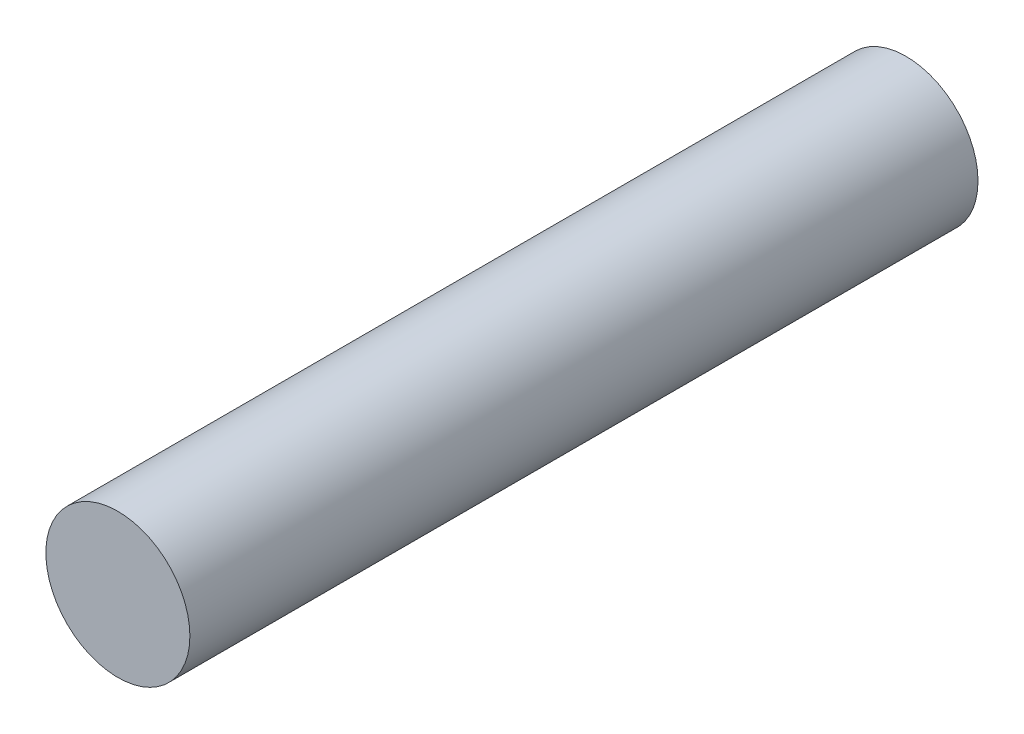
ISO-10303-21;
HEADER;
FILE_DESCRIPTION(('STEP AP214'),'2;1');
FILE_NAME('part.step','',(''),(''),'','','');
FILE_SCHEMA(('AUTOMOTIVE_DESIGN { 1 0 10303 214 1 1 1 1 }'));
ENDSEC;
DATA;
#1=APPLICATION_CONTEXT('core data for automotive mechanical design processes');
#2=APPLICATION_PROTOCOL_DEFINITION('international standard','automotive_design',2000,#1);
#3=PRODUCT_CONTEXT('',#1,'mechanical');
#4=PRODUCT('Part','Part','',(#3));
#5=PRODUCT_RELATED_PRODUCT_CATEGORY('part','',(#4));
#6=PRODUCT_DEFINITION_FORMATION('','',#4);
#7=PRODUCT_DEFINITION_CONTEXT('part definition',#1,'design');
#8=PRODUCT_DEFINITION('design','',#6,#7);
#9=PRODUCT_DEFINITION_SHAPE('','',#8);
#10=(LENGTH_UNIT() NAMED_UNIT(*) SI_UNIT(.MILLI.,.METRE.));
#11=(NAMED_UNIT(*) PLANE_ANGLE_UNIT() SI_UNIT($,.RADIAN.));
#12=(NAMED_UNIT(*) SI_UNIT($,.STERADIAN.) SOLID_ANGLE_UNIT());
#13=UNCERTAINTY_MEASURE_WITH_UNIT(LENGTH_MEASURE(1.E-05),#10,'distance_accuracy_value','');
#14=(GEOMETRIC_REPRESENTATION_CONTEXT(3) GLOBAL_UNCERTAINTY_ASSIGNED_CONTEXT((#13)) GLOBAL_UNIT_ASSIGNED_CONTEXT((#10,
#11,#12)) REPRESENTATION_CONTEXT('',''));
#15=CARTESIAN_POINT('',(0.,0.,0.));
#16=DIRECTION('',(0.,0.,1.));
#17=DIRECTION('',(1.,0.,0.));
#18=AXIS2_PLACEMENT_3D('',#15,#16,#17);
#19=CARTESIAN_POINT('',(0.,0.,580.));
#20=DIRECTION('',(0.,0.,-1.));
#21=DIRECTION('',(-1.,0.,0.));
#22=AXIS2_PLACEMENT_3D('',#19,#20,#21);
#23=CYLINDRICAL_SURFACE('',#22,53.);
#24=CARTESIAN_POINT('',(0.,0.,580.));
#25=DIRECTION('',(0.,0.,1.));
#26=DIRECTION('',(1.,0.,0.));
#27=AXIS2_PLACEMENT_3D('',#24,#25,#26);
#28=CIRCLE('',#27,53.);
#29=CARTESIAN_POINT('',(53.,0.,580.));
#30=VERTEX_POINT('',#29);
#31=EDGE_CURVE('E10',#30,#30,#28,.T.);
#32=ORIENTED_EDGE('',*,*,#31,.F.);
#33=EDGE_LOOP('',(#32));
#34=FACE_BOUND('',#33,.T.);
#35=CARTESIAN_POINT('',(0.,0.,0.));
#36=DIRECTION('',(0.,0.,1.));
#37=DIRECTION('',(1.,0.,0.));
#38=AXIS2_PLACEMENT_3D('',#35,#36,#37);
#39=CIRCLE('',#38,53.);
#40=CARTESIAN_POINT('',(53.,0.,0.));
#41=VERTEX_POINT('',#40);
#42=EDGE_CURVE('E36',#41,#41,#39,.T.);
#43=ORIENTED_EDGE('',*,*,#42,.T.);
#44=EDGE_LOOP('',(#43));
#45=FACE_BOUND('',#44,.T.);
#46=ADVANCED_FACE('F33',(#34,#45),#23,.T.);
#47=CARTESIAN_POINT('',(0.,0.,580.));
#48=DIRECTION('',(0.,0.,1.));
#49=DIRECTION('',(1.,0.,0.));
#50=AXIS2_PLACEMENT_3D('',#47,#48,#49);
#51=PLANE('',#50);
#52=ORIENTED_EDGE('',*,*,#31,.T.);
#53=EDGE_LOOP('',(#52));
#54=FACE_BOUND('',#53,.T.);
#55=ADVANCED_FACE('F48',(#54),#51,.T.);
#56=CARTESIAN_POINT('',(0.,0.,0.));
#57=DIRECTION('',(0.,0.,1.));
#58=DIRECTION('',(1.,0.,0.));
#59=AXIS2_PLACEMENT_3D('',#56,#57,#58);
#60=PLANE('',#59);
#61=ORIENTED_EDGE('',*,*,#42,.F.);
#62=EDGE_LOOP('',(#61));
#63=FACE_BOUND('',#62,.T.);
#64=ADVANCED_FACE('F46',(#63),#60,.F.);
#65=CLOSED_SHELL('',(#46,#55,#64));
#66=MANIFOLD_SOLID_BREP('B2',#65);
#67=ADVANCED_BREP_SHAPE_REPRESENTATION('',(#18,#66),#14);
#68=SHAPE_DEFINITION_REPRESENTATION(#9,#67);
ENDSEC;
END-ISO-10303-21;
